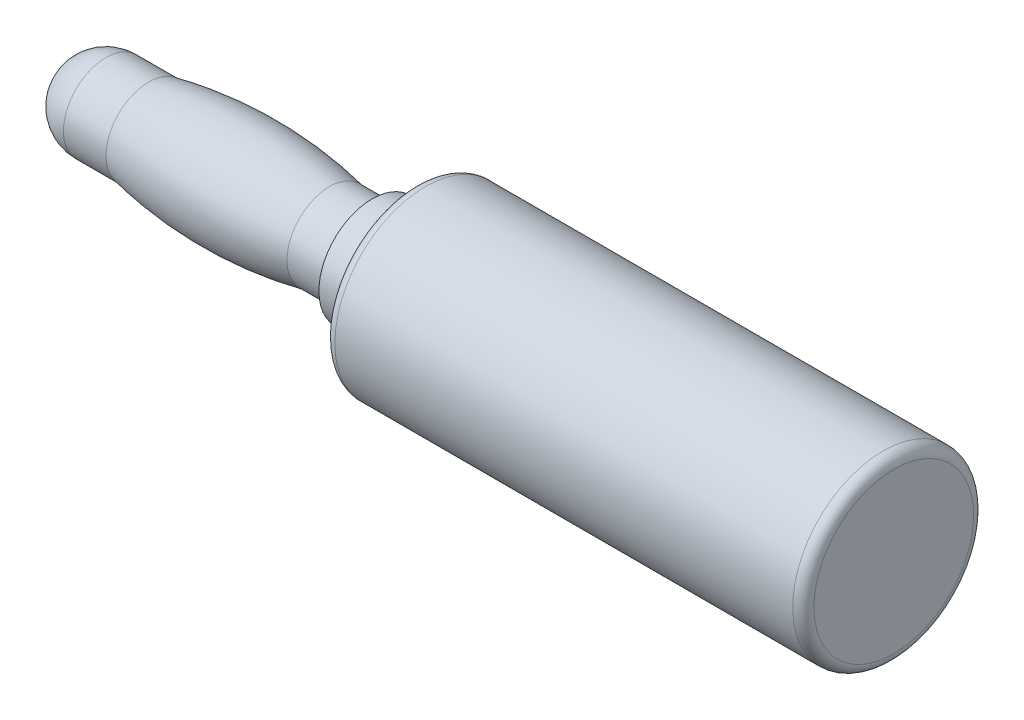
ISO-10303-21;
HEADER;
FILE_DESCRIPTION(('STEP AP214'),'2;1');
FILE_NAME('part.step','',(''),(''),'','','');
FILE_SCHEMA(('AUTOMOTIVE_DESIGN { 1 0 10303 214 1 1 1 1 }'));
ENDSEC;
DATA;
#1=APPLICATION_CONTEXT('core data for automotive mechanical design processes');
#2=APPLICATION_PROTOCOL_DEFINITION('international standard','automotive_design',2000,#1);
#3=PRODUCT_CONTEXT('',#1,'mechanical');
#4=PRODUCT('Part','Part','',(#3));
#5=PRODUCT_RELATED_PRODUCT_CATEGORY('part','',(#4));
#6=PRODUCT_DEFINITION_FORMATION('','',#4);
#7=PRODUCT_DEFINITION_CONTEXT('part definition',#1,'design');
#8=PRODUCT_DEFINITION('design','',#6,#7);
#9=PRODUCT_DEFINITION_SHAPE('','',#8);
#10=(LENGTH_UNIT() NAMED_UNIT(*) SI_UNIT(.MILLI.,.METRE.));
#11=(NAMED_UNIT(*) PLANE_ANGLE_UNIT() SI_UNIT($,.RADIAN.));
#12=(NAMED_UNIT(*) SI_UNIT($,.STERADIAN.) SOLID_ANGLE_UNIT());
#13=UNCERTAINTY_MEASURE_WITH_UNIT(LENGTH_MEASURE(1.E-05),#10,'distance_accuracy_value','');
#14=(GEOMETRIC_REPRESENTATION_CONTEXT(3) GLOBAL_UNCERTAINTY_ASSIGNED_CONTEXT((#13)) GLOBAL_UNIT_ASSIGNED_CONTEXT((#10,
#11,#12)) REPRESENTATION_CONTEXT('',''));
#15=CARTESIAN_POINT('',(0.,0.,0.));
#16=DIRECTION('',(0.,0.,1.));
#17=DIRECTION('',(1.,0.,0.));
#18=AXIS2_PLACEMENT_3D('',#15,#16,#17);
#19=CARTESIAN_POINT('',(0.,0.,0.));
#20=DIRECTION('',(1.,0.,0.));
#21=DIRECTION('',(0.,1.,0.));
#22=AXIS2_PLACEMENT_3D('',#19,#20,#21);
#23=PLANE('',#22);
#24=CARTESIAN_POINT('',(0.,0.,0.));
#25=DIRECTION('',(1.,0.,0.));
#26=DIRECTION('',(0.,1.,0.));
#27=AXIS2_PLACEMENT_3D('',#24,#25,#26);
#28=CIRCLE('',#27,3.74999999999996);
#29=CARTESIAN_POINT('',(0.,3.75000000000002,0.));
#30=VERTEX_POINT('',#29);
#31=EDGE_CURVE('E122',#30,#30,#28,.T.);
#32=ORIENTED_EDGE('',*,*,#31,.T.);
#33=EDGE_LOOP('',(#32));
#34=FACE_BOUND('',#33,.T.);
#35=ADVANCED_FACE('F45',(#34),#23,.T.);
#36=CARTESIAN_POINT('',(-37.,0.,0.));
#37=DIRECTION('',(1.,0.,0.));
#38=DIRECTION('',(0.,1.,0.));
#39=AXIS2_PLACEMENT_3D('',#36,#37,#38);
#40=SPHERICAL_SURFACE('',#39,2.);
#41=CARTESIAN_POINT('',(-37.,0.,0.));
#42=DIRECTION('',(1.,0.,0.));
#43=DIRECTION('',(0.,1.,0.));
#44=AXIS2_PLACEMENT_3D('',#41,#42,#43);
#45=CIRCLE('',#44,1.99999999999999);
#46=CARTESIAN_POINT('',(-37.,1.99999999999999,0.));
#47=VERTEX_POINT('',#46);
#48=EDGE_CURVE('E132',#47,#47,#45,.T.);
#49=ORIENTED_EDGE('',*,*,#48,.F.);
#50=EDGE_LOOP('',(#49));
#51=FACE_BOUND('',#50,.T.);
#52=ADVANCED_FACE('F94',(#51),#40,.T.);
#53=CARTESIAN_POINT('',(-39.,0.,0.));
#54=DIRECTION('',(1.,0.,0.));
#55=DIRECTION('',(0.,1.,0.));
#56=AXIS2_PLACEMENT_3D('',#53,#54,#55);
#57=CYLINDRICAL_SURFACE('',#56,1.99999999999999);
#58=ORIENTED_EDGE('',*,*,#48,.T.);
#59=EDGE_LOOP('',(#58));
#60=FACE_BOUND('',#59,.T.);
#61=CARTESIAN_POINT('',(-35.,0.,0.));
#62=DIRECTION('',(1.,0.,0.));
#63=DIRECTION('',(0.,1.,0.));
#64=AXIS2_PLACEMENT_3D('',#61,#62,#63);
#65=CIRCLE('',#64,1.99999999999999);
#66=CARTESIAN_POINT('',(-35.,2.,0.));
#67=VERTEX_POINT('',#66);
#68=EDGE_CURVE('E135',#67,#67,#65,.T.);
#69=ORIENTED_EDGE('',*,*,#68,.F.);
#70=EDGE_LOOP('',(#69));
#71=FACE_BOUND('',#70,.T.);
#72=ADVANCED_FACE('F100',(#60,#71),#57,.T.);
#73=CARTESIAN_POINT('',(-30.75,0.,0.));
#74=DIRECTION('',(1.,0.,0.));
#75=DIRECTION('',(0.,1.,0.));
#76=AXIS2_PLACEMENT_3D('',#73,#74,#75);
#77=DEGENERATE_TOROIDAL_SURFACE('',#76,18.6577238009088,21.0903782003698,.F.);
#78=ORIENTED_EDGE('',*,*,#68,.T.);
#79=EDGE_LOOP('',(#78));
#80=FACE_BOUND('',#79,.T.);
#81=CARTESIAN_POINT('',(-26.5,0.,0.));
#82=DIRECTION('',(1.,0.,0.));
#83=DIRECTION('',(0.,1.,0.));
#84=AXIS2_PLACEMENT_3D('',#81,#82,#83);
#85=CIRCLE('',#84,1.99999999999998);
#86=CARTESIAN_POINT('',(-26.5,2.,0.));
#87=VERTEX_POINT('',#86);
#88=EDGE_CURVE('E138',#87,#87,#85,.T.);
#89=ORIENTED_EDGE('',*,*,#88,.F.);
#90=EDGE_LOOP('',(#89));
#91=FACE_BOUND('',#90,.T.);
#92=ADVANCED_FACE('F234',(#80,#91),#77,.F.);
#93=CARTESIAN_POINT('',(-39.,0.,0.));
#94=DIRECTION('',(1.,0.,0.));
#95=DIRECTION('',(0.,1.,0.));
#96=AXIS2_PLACEMENT_3D('',#93,#94,#95);
#97=CYLINDRICAL_SURFACE('',#96,1.99999999999998);
#98=ORIENTED_EDGE('',*,*,#88,.T.);
#99=EDGE_LOOP('',(#98));
#100=FACE_BOUND('',#99,.T.);
#101=CARTESIAN_POINT('',(-24.5,0.,0.));
#102=DIRECTION('',(1.,0.,0.));
#103=DIRECTION('',(0.,1.,0.));
#104=AXIS2_PLACEMENT_3D('',#101,#102,#103);
#105=CIRCLE('',#104,1.99999999999997);
#106=CARTESIAN_POINT('',(-24.5,2.,0.));
#107=VERTEX_POINT('',#106);
#108=EDGE_CURVE('E141',#107,#107,#105,.T.);
#109=ORIENTED_EDGE('',*,*,#108,.F.);
#110=EDGE_LOOP('',(#109));
#111=FACE_BOUND('',#110,.T.);
#112=ADVANCED_FACE('F224',(#100,#111),#97,.T.);
#113=CARTESIAN_POINT('',(-24.5,2.5,0.));
#114=DIRECTION('',(-1.,0.,0.));
#115=DIRECTION('',(0.,-1.,0.));
#116=AXIS2_PLACEMENT_3D('',#113,#114,#115);
#117=PLANE('',#116);
#118=ORIENTED_EDGE('',*,*,#108,.T.);
#119=EDGE_LOOP('',(#118));
#120=FACE_BOUND('',#119,.T.);
#121=CARTESIAN_POINT('',(-24.5,0.,0.));
#122=DIRECTION('',(1.,0.,0.));
#123=DIRECTION('',(0.,1.,0.));
#124=AXIS2_PLACEMENT_3D('',#121,#122,#123);
#125=CIRCLE('',#124,2.49999999999997);
#126=CARTESIAN_POINT('',(-24.5,2.5,0.));
#127=VERTEX_POINT('',#126);
#128=EDGE_CURVE('E144',#127,#127,#125,.T.);
#129=ORIENTED_EDGE('',*,*,#128,.F.);
#130=EDGE_LOOP('',(#129));
#131=FACE_BOUND('',#130,.T.);
#132=ADVANCED_FACE('F214',(#120,#131),#117,.T.);
#133=CARTESIAN_POINT('',(-39.,0.,0.));
#134=DIRECTION('',(1.,0.,0.));
#135=DIRECTION('',(0.,1.,0.));
#136=AXIS2_PLACEMENT_3D('',#133,#134,#135);
#137=CYLINDRICAL_SURFACE('',#136,2.49999999999997);
#138=CARTESIAN_POINT('',(-23.,0.,0.));
#139=DIRECTION('',(-1.,0.,0.));
#140=DIRECTION('',(0.,-1.,0.));
#141=AXIS2_PLACEMENT_3D('',#138,#139,#140);
#142=CIRCLE('',#141,2.49999999999997);
#143=CARTESIAN_POINT('',(-23.,-2.49999999999995,0.));
#144=VERTEX_POINT('',#143);
#145=EDGE_CURVE('E123',#144,#144,#142,.T.);
#146=ORIENTED_EDGE('',*,*,#145,.T.);
#147=EDGE_LOOP('',(#146));
#148=FACE_BOUND('',#147,.T.);
#149=ORIENTED_EDGE('',*,*,#128,.T.);
#150=EDGE_LOOP('',(#149));
#151=FACE_BOUND('',#150,.T.);
#152=ADVANCED_FACE('F207',(#148,#151),#137,.T.);
#153=CARTESIAN_POINT('',(-22.5,4.25,0.));
#154=DIRECTION('',(-1.,0.,0.));
#155=DIRECTION('',(0.,-1.,0.));
#156=AXIS2_PLACEMENT_3D('',#153,#154,#155);
#157=PLANE('',#156);
#158=CARTESIAN_POINT('',(-22.5,0.,0.));
#159=DIRECTION('',(-1.,0.,0.));
#160=DIRECTION('',(0.,-1.,0.));
#161=AXIS2_PLACEMENT_3D('',#158,#159,#160);
#162=CIRCLE('',#161,3.74999999999996);
#163=CARTESIAN_POINT('',(-22.5,-3.74999999999993,0.));
#164=VERTEX_POINT('',#163);
#165=EDGE_CURVE('E10',#164,#164,#162,.T.);
#166=ORIENTED_EDGE('',*,*,#165,.T.);
#167=EDGE_LOOP('',(#166));
#168=FACE_BOUND('',#167,.T.);
#169=CARTESIAN_POINT('',(-22.5,0.,0.));
#170=DIRECTION('',(-1.,0.,0.));
#171=DIRECTION('',(0.,-1.,0.));
#172=AXIS2_PLACEMENT_3D('',#169,#170,#171);
#173=CIRCLE('',#172,2.99999999999999);
#174=CARTESIAN_POINT('',(-22.5,-2.99999999999997,0.));
#175=VERTEX_POINT('',#174);
#176=EDGE_CURVE('E127',#175,#175,#173,.F.);
#177=ORIENTED_EDGE('',*,*,#176,.T.);
#178=EDGE_LOOP('',(#177));
#179=FACE_BOUND('',#178,.T.);
#180=ADVANCED_FACE('F199',(#168,#179),#157,.T.);
#181=CARTESIAN_POINT('',(-39.,0.,0.));
#182=DIRECTION('',(1.,0.,0.));
#183=DIRECTION('',(0.,1.,0.));
#184=AXIS2_PLACEMENT_3D('',#181,#182,#183);
#185=CYLINDRICAL_SURFACE('',#184,4.24999999999996);
#186=CARTESIAN_POINT('',(-19.05,-3.74999999999992,2.00000000000001));
#187=CARTESIAN_POINT('',(-19.1551351063821,-3.75000826796803,1.99999278334831));
#188=CARTESIAN_POINT('',(-19.26042730687,-3.75448741611169,1.99165534548257));
#189=CARTESIAN_POINT('',(-19.4678515144892,-3.7717821759577,1.9586947567193));
#190=CARTESIAN_POINT('',(-19.569975535006,-3.78461730511005,1.93403347520457));
#191=CARTESIAN_POINT('',(-19.7676830955408,-3.81681669010783,1.86967542118156));
#192=CARTESIAN_POINT('',(-19.8632957176334,-3.83614926171444,1.830051499051));
#193=CARTESIAN_POINT('',(-20.0464930187898,-3.87911711724461,1.7371133035507));
#194=CARTESIAN_POINT('',(-20.1340780918536,-3.90275218982694,1.68379970257276));
#195=CARTESIAN_POINT('',(-20.3057761791103,-3.95376638499189,1.56044698465515));
#196=CARTESIAN_POINT('',(-20.38917516974,-3.981292756821,1.48947442523931));
#197=CARTESIAN_POINT('',(-20.5434317280766,-4.03579286280287,1.33476674141144));
#198=CARTESIAN_POINT('',(-20.6142836172328,-4.06276634186973,1.25102587007802));
#199=CARTESIAN_POINT('',(-20.7454454837746,-4.11499751826743,1.06720742669445));
#200=CARTESIAN_POINT('',(-20.8049048011291,-4.14006473333039,0.966463718686681));
#201=CARTESIAN_POINT('',(-20.9057108570117,-4.18378926835605,0.755005012555769));
#202=CARTESIAN_POINT('',(-20.947067751098,-4.20245018101856,0.644295647361232));
#203=CARTESIAN_POINT('',(-21.0077577751267,-4.23020518255971,0.423589142627611));
#204=CARTESIAN_POINT('',(-21.0283351919889,-4.23983689955257,0.314003244761928));
#205=CARTESIAN_POINT('',(-21.0509513380081,-4.25043525721599,0.0925416224293595));
#206=CARTESIAN_POINT('',(-21.052999850037,-4.2514064704465,-0.0193328624347068));
#207=CARTESIAN_POINT('',(-21.0390448864131,-4.24485266705171,-0.232957740722031));
#208=CARTESIAN_POINT('',(-21.024423648774,-4.23797816327227,-0.334822623791652));
#209=CARTESIAN_POINT('',(-20.9799788056287,-4.21745550548773,-0.534453784798));
#210=CARTESIAN_POINT('',(-20.9501540704467,-4.20380684814005,-0.63221975758631));
#211=CARTESIAN_POINT('',(-20.8758774709504,-4.17075647852699,-0.822665598035224));
#212=CARTESIAN_POINT('',(-20.8312153119756,-4.1512724760105,-0.915248575743634));
#213=CARTESIAN_POINT('',(-20.7287819878923,-4.10836318891228,-1.09184352283673));
#214=CARTESIAN_POINT('',(-20.67100601955,-4.08493646103166,-1.17585233535157));
#215=CARTESIAN_POINT('',(-20.5382386389836,-4.03401523997968,-1.34062814120459));
#216=CARTESIAN_POINT('',(-20.4621927117795,-4.006344176968,-1.42049184689529));
#217=CARTESIAN_POINT('',(-20.2979133656414,-3.95142965483077,-1.56678712698685));
#218=CARTESIAN_POINT('',(-20.2096724641763,-3.92418646975775,-1.6332103925353));
#219=CARTESIAN_POINT('',(-20.0179169246959,-3.87174945488614,-1.7540295774939));
#220=CARTESIAN_POINT('',(-19.9138513853599,-3.84673212699408,-1.80763495532405));
#221=CARTESIAN_POINT('',(-19.6967014855463,-3.80387372392291,-1.8961779554245));
#222=CARTESIAN_POINT('',(-19.5836256642997,-3.78602594870339,-1.93113301673437));
#223=CARTESIAN_POINT('',(-19.3606961373909,-3.76134460330738,-1.97875198730774));
#224=CARTESIAN_POINT('',(-19.2512421099273,-3.75378216701695,-1.99289764315747));
#225=CARTESIAN_POINT('',(-19.0312866509959,-3.74843861883772,-2.00293559518053));
#226=CARTESIAN_POINT('',(-18.9207858200787,-3.75065220179317,-1.99883779152855));
#227=CARTESIAN_POINT('',(-18.712590510147,-3.76384360402546,-1.97386396774598));
#228=CARTESIAN_POINT('',(-18.6146483912,-3.77400220115411,-1.95455509541394));
#229=CARTESIAN_POINT('',(-18.4235379607881,-3.80078810785445,-1.90193965757173));
#230=CARTESIAN_POINT('',(-18.3303710092433,-3.81741724871488,-1.86862912910832));
#231=CARTESIAN_POINT('',(-18.1466064421498,-3.85618583973208,-1.78730013829356));
#232=CARTESIAN_POINT('',(-18.0563254870845,-3.87854405125029,-1.7386742081627));
#233=CARTESIAN_POINT('',(-17.8847071803238,-3.92601486842514,-1.62864818014454));
#234=CARTESIAN_POINT('',(-17.8033743072674,-3.95112884093117,-1.56724172949261));
#235=CARTESIAN_POINT('',(-17.6427038072501,-4.00457596290915,-1.42555297710964));
#236=CARTESIAN_POINT('',(-17.5645493290614,-4.03296169775034,-1.343942958321));
#237=CARTESIAN_POINT('',(-17.4227314234118,-4.08732284866454,-1.16822321572152));
#238=CARTESIAN_POINT('',(-17.3590712321855,-4.11329772568413,-1.07411070781092));
#239=CARTESIAN_POINT('',(-17.2472972976474,-4.16048375973412,-0.873847730637521));
#240=CARTESIAN_POINT('',(-17.1994465769902,-4.18161268955565,-0.767529784141012));
#241=CARTESIAN_POINT('',(-17.1227492037265,-4.21611347538394,-0.547078644303476));
#242=CARTESIAN_POINT('',(-17.0938878063873,-4.22949134892526,-0.432951590741842));
#243=CARTESIAN_POINT('',(-17.0581987820791,-4.24612174611838,-0.210536703782477));
#244=CARTESIAN_POINT('',(-17.0497153202424,-4.25013436745775,-0.102570398118327));
#245=CARTESIAN_POINT('',(-17.0502990419966,-4.24985887396109,0.113289661299023));
#246=CARTESIAN_POINT('',(-17.0593614019901,-4.24557304048894,0.221183426837401));
#247=CARTESIAN_POINT('',(-17.0936256300385,-4.22962074592399,0.42775483968097));
#248=CARTESIAN_POINT('',(-17.1179315447508,-4.21836441710525,0.526615823187464));
#249=CARTESIAN_POINT('',(-17.1808735253732,-4.18991025109661,0.71874240116149));
#250=CARTESIAN_POINT('',(-17.2195118875086,-4.17271146188544,0.812007096255168));
#251=CARTESIAN_POINT('',(-17.311903449813,-4.13299701390712,0.994986067640839));
#252=CARTESIAN_POINT('',(-17.366260562096,-4.11027628014103,1.08434967071781));
#253=CARTESIAN_POINT('',(-17.4877516115414,-4.0620206412084,1.25307691467297));
#254=CARTESIAN_POINT('',(-17.5548913339601,-4.03648446401703,1.33243600049027));
#255=CARTESIAN_POINT('',(-17.7070062617157,-3.98254227734086,1.48629743882136));
#256=CARTESIAN_POINT('',(-17.7930358134209,-3.95408278559701,1.5597427906502));
#257=CARTESIAN_POINT('',(-17.9767920284928,-3.8995598263201,1.69145664018933));
#258=CARTESIAN_POINT('',(-18.0745271101748,-3.87349810731035,1.74971411835707));
#259=CARTESIAN_POINT('',(-18.2812910143234,-3.82664282343468,1.84998465272072));
#260=CARTESIAN_POINT('',(-18.3904701249221,-3.80593623458327,1.89173472202985));
#261=CARTESIAN_POINT('',(-18.5590734925624,-3.78158635213784,1.93969419917216));
#262=CARTESIAN_POINT('',(-18.6160256253766,-3.7745914281405,1.95323067130279));
#263=CARTESIAN_POINT('',(-18.731127869375,-3.76309905665179,1.97528331651136));
#264=CARTESIAN_POINT('',(-18.7892770774398,-3.75859979313669,1.98380314034535));
#265=CARTESIAN_POINT('',(-18.8813096281406,-3.75364230035754,1.99315910354233));
#266=CARTESIAN_POINT('',(-18.9149799404498,-3.75227911858258,1.99572230857722));
#267=CARTESIAN_POINT('',(-18.982428088024,-3.75045661730985,1.9991439586842));
#268=CARTESIAN_POINT('',(-19.0162059285095,-3.74999734238806,2.00000231968228));
#269=CARTESIAN_POINT('',(-19.05,-3.74999999999992,2.00000000000001));
#270=B_SPLINE_CURVE_WITH_KNOTS('',3,(#186,#187,#188,#189,#190,#191,#192,#193,#194,#195,#196,
#197,#198,#199,#200,#201,#202,#203,#204,#205,#206,#207,#208,#209,#210,#211,#212,#213,#214,#215,
#216,#217,#218,#219,#220,#221,#222,#223,#224,#225,#226,#227,#228,#229,#230,#231,#232,#233,#234,
#235,#236,#237,#238,#239,#240,#241,#242,#243,#244,#245,#246,#247,#248,#249,#250,#251,#252,#253,
#254,#255,#256,#257,#258,#259,#260,#261,#262,#263,#264,#265,#266,#267,#268,#269),.UNSPECIFIED.,
.T.,.F.,(4,2,2,2,2,2,2,2,2,2,2,2,2,2,2,2,2,2,2,2,2,2,2,2,2,2,2,2,2,2,2,2,2,2,2,2,2,2,2,2,2,4),
(0.,0.315269532227727,0.631278108915348,0.945767530612494,1.26024150858191,1.59755236089319,
1.93501548491414,2.29206735755066,2.64891866460437,2.98284261865034,3.31659025757552,
3.62455689648693,3.93254642178981,4.24510194492123,4.55777213395659,4.89738779630132,
5.23721277119903,5.59444791639953,5.95134843969611,6.28134455917522,6.61116162155772,
6.91084495979816,7.21061317596954,7.52420647490137,7.83795602433331,8.18589395188133,
8.53390948979741,8.88745332877818,9.24072232485335,9.56413887866949,9.8874665332751,
10.1933723847736,10.4993272671441,10.8191023907284,11.1390225862344,11.4873507068093,
11.835930857445,12.1898599395636,12.3664988027649,12.5430089615176,12.6443425322434,
12.7456811000871),.UNSPECIFIED.);
#271=CARTESIAN_POINT('',(-19.05,-3.74999999999992,2.00000000000001));
#272=VERTEX_POINT('',#271);
#273=EDGE_CURVE('E49',#272,#272,#270,.T.);
#274=ORIENTED_EDGE('',*,*,#273,.F.);
#275=EDGE_LOOP('',(#274));
#276=FACE_BOUND('',#275,.T.);
#277=CARTESIAN_POINT('',(-12.7,-3.74999999999991,2.));
#278=CARTESIAN_POINT('',(-12.8051351063821,-3.75000826796802,1.99999278334831));
#279=CARTESIAN_POINT('',(-12.91042730687,-3.75448741611169,1.99165534548257));
#280=CARTESIAN_POINT('',(-13.1178515144891,-3.77178217595769,1.9586947567193));
#281=CARTESIAN_POINT('',(-13.2199755350059,-3.78461730511004,1.93403347520457));
#282=CARTESIAN_POINT('',(-13.4176830955408,-3.81681669010782,1.86967542118155));
#283=CARTESIAN_POINT('',(-13.5132957176334,-3.83614926171444,1.830051499051));
#284=CARTESIAN_POINT('',(-13.6964930187898,-3.87911711724461,1.7371133035507));
#285=CARTESIAN_POINT('',(-13.7840780918536,-3.90275218982694,1.68379970257276));
#286=CARTESIAN_POINT('',(-13.9557761791103,-3.95376638499188,1.56044698465515));
#287=CARTESIAN_POINT('',(-14.03917516974,-3.98129275682099,1.48947442523931));
#288=CARTESIAN_POINT('',(-14.1934317280766,-4.03579286280286,1.33476674141144));
#289=CARTESIAN_POINT('',(-14.2642836172328,-4.06276634186972,1.25102587007802));
#290=CARTESIAN_POINT('',(-14.3954454837746,-4.11499751826742,1.06720742669445));
#291=CARTESIAN_POINT('',(-14.4549048011291,-4.14006473333038,0.966463718686681));
#292=CARTESIAN_POINT('',(-14.5557108570117,-4.18378926835604,0.755005012555768));
#293=CARTESIAN_POINT('',(-14.597067751098,-4.20245018101855,0.64429564736123));
#294=CARTESIAN_POINT('',(-14.6577577751267,-4.2302051825597,0.423589142627608));
#295=CARTESIAN_POINT('',(-14.6783351919889,-4.23983689955256,0.314003244761926));
#296=CARTESIAN_POINT('',(-14.7009513380081,-4.25043525721598,0.0925416224293584));
#297=CARTESIAN_POINT('',(-14.702999850037,-4.25140647044649,-0.0193328624347077));
#298=CARTESIAN_POINT('',(-14.6890448864131,-4.2448526670517,-0.232957740722031));
#299=CARTESIAN_POINT('',(-14.674423648774,-4.23797816327226,-0.334822623791652));
#300=CARTESIAN_POINT('',(-14.6299788056287,-4.21745550548772,-0.534453784797999));
#301=CARTESIAN_POINT('',(-14.6001540704467,-4.20380684814004,-0.63221975758631));
#302=CARTESIAN_POINT('',(-14.5258774709504,-4.17075647852698,-0.822665598035224));
#303=CARTESIAN_POINT('',(-14.4812153119756,-4.15127247601049,-0.915248575743632));
#304=CARTESIAN_POINT('',(-14.3787819878923,-4.10836318891227,-1.09184352283672));
#305=CARTESIAN_POINT('',(-14.32100601955,-4.08493646103165,-1.17585233535157));
#306=CARTESIAN_POINT('',(-14.1882386389836,-4.03401523997967,-1.34062814120459));
#307=CARTESIAN_POINT('',(-14.1121927117795,-4.00634417696799,-1.42049184689528));
#308=CARTESIAN_POINT('',(-13.9479133656414,-3.95142965483076,-1.56678712698685));
#309=CARTESIAN_POINT('',(-13.8596724641763,-3.92418646975775,-1.6332103925353));
#310=CARTESIAN_POINT('',(-13.6679169246959,-3.87174945488614,-1.7540295774939));
#311=CARTESIAN_POINT('',(-13.5638513853599,-3.84673212699407,-1.80763495532405));
#312=CARTESIAN_POINT('',(-13.3467014855463,-3.8038737239229,-1.8961779554245));
#313=CARTESIAN_POINT('',(-13.2336256642997,-3.78602594870338,-1.93113301673436));
#314=CARTESIAN_POINT('',(-13.0106961373909,-3.76134460330737,-1.97875198730773));
#315=CARTESIAN_POINT('',(-12.9012421099273,-3.75378216701695,-1.99289764315747));
#316=CARTESIAN_POINT('',(-12.6812866509959,-3.74843861883771,-2.00293559518052));
#317=CARTESIAN_POINT('',(-12.5707858200787,-3.75065220179317,-1.99883779152855));
#318=CARTESIAN_POINT('',(-12.362590510147,-3.76384360402545,-1.97386396774598));
#319=CARTESIAN_POINT('',(-12.2646483912,-3.7740022011541,-1.95455509541393));
#320=CARTESIAN_POINT('',(-12.0735379607881,-3.80078810785444,-1.90193965757173));
#321=CARTESIAN_POINT('',(-11.9803710092433,-3.81741724871487,-1.86862912910832));
#322=CARTESIAN_POINT('',(-11.7966064421498,-3.85618583973207,-1.78730013829356));
#323=CARTESIAN_POINT('',(-11.7063254870845,-3.87854405125028,-1.7386742081627));
#324=CARTESIAN_POINT('',(-11.5347071803238,-3.92601486842513,-1.62864818014454));
#325=CARTESIAN_POINT('',(-11.4533743072674,-3.95112884093116,-1.56724172949261));
#326=CARTESIAN_POINT('',(-11.2927038072501,-4.00457596290914,-1.42555297710963));
#327=CARTESIAN_POINT('',(-11.2145493290614,-4.03296169775033,-1.34394295832099));
#328=CARTESIAN_POINT('',(-11.0727314234118,-4.08732284866453,-1.16822321572152));
#329=CARTESIAN_POINT('',(-11.0090712321855,-4.11329772568412,-1.07411070781091));
#330=CARTESIAN_POINT('',(-10.8972972976474,-4.16048375973411,-0.87384773063752));
#331=CARTESIAN_POINT('',(-10.8494465769902,-4.18161268955564,-0.76752978414101));
#332=CARTESIAN_POINT('',(-10.7727492037265,-4.21611347538393,-0.547078644303475));
#333=CARTESIAN_POINT('',(-10.7438878063873,-4.22949134892525,-0.432951590741842));
#334=CARTESIAN_POINT('',(-10.7081987820791,-4.24612174611837,-0.210536703782476));
#335=CARTESIAN_POINT('',(-10.6997153202424,-4.25013436745773,-0.102570398118326));
#336=CARTESIAN_POINT('',(-10.7002990419966,-4.24985887396108,0.113289661299024));
#337=CARTESIAN_POINT('',(-10.7093614019901,-4.24557304048893,0.221183426837401));
#338=CARTESIAN_POINT('',(-10.7436256300385,-4.22962074592398,0.42775483968097));
#339=CARTESIAN_POINT('',(-10.7679315447508,-4.21836441710524,0.526615823187464));
#340=CARTESIAN_POINT('',(-10.8308735253732,-4.1899102510966,0.71874240116149));
#341=CARTESIAN_POINT('',(-10.8695118875086,-4.17271146188543,0.812007096255168));
#342=CARTESIAN_POINT('',(-10.961903449813,-4.13299701390711,0.994986067640839));
#343=CARTESIAN_POINT('',(-11.016260562096,-4.11027628014102,1.08434967071781));
#344=CARTESIAN_POINT('',(-11.1377516115414,-4.0620206412084,1.25307691467297));
#345=CARTESIAN_POINT('',(-11.2048913339601,-4.03648446401702,1.33243600049026));
#346=CARTESIAN_POINT('',(-11.3570062617158,-3.98254227734085,1.48629743882136));
#347=CARTESIAN_POINT('',(-11.4430358134209,-3.954082785597,1.5597427906502));
#348=CARTESIAN_POINT('',(-11.6267920284928,-3.89955982632009,1.69145664018932));
#349=CARTESIAN_POINT('',(-11.7245271101748,-3.87349810731034,1.74971411835706));
#350=CARTESIAN_POINT('',(-11.9312910143234,-3.82664282343468,1.84998465272071));
#351=CARTESIAN_POINT('',(-12.0404701249221,-3.80593623458326,1.89173472202985));
#352=CARTESIAN_POINT('',(-12.2090734925624,-3.78158635213783,1.93969419917216));
#353=CARTESIAN_POINT('',(-12.2660256253766,-3.77459142814049,1.95323067130279));
#354=CARTESIAN_POINT('',(-12.381127869375,-3.76309905665178,1.97528331651135));
#355=CARTESIAN_POINT('',(-12.4392770774398,-3.75859979313668,1.98380314034534));
#356=CARTESIAN_POINT('',(-12.5313096281406,-3.75364230035753,1.99315910354233));
#357=CARTESIAN_POINT('',(-12.5649799404498,-3.75227911858257,1.99572230857722));
#358=CARTESIAN_POINT('',(-12.632428088024,-3.75045661730985,1.9991439586842));
#359=CARTESIAN_POINT('',(-12.6662059285095,-3.74999734238805,2.00000231968228));
#360=CARTESIAN_POINT('',(-12.7,-3.74999999999991,2.));
#361=B_SPLINE_CURVE_WITH_KNOTS('',3,(#277,#278,#279,#280,#281,#282,#283,#284,#285,#286,#287,
#288,#289,#290,#291,#292,#293,#294,#295,#296,#297,#298,#299,#300,#301,#302,#303,#304,#305,#306,
#307,#308,#309,#310,#311,#312,#313,#314,#315,#316,#317,#318,#319,#320,#321,#322,#323,#324,#325,
#326,#327,#328,#329,#330,#331,#332,#333,#334,#335,#336,#337,#338,#339,#340,#341,#342,#343,#344,
#345,#346,#347,#348,#349,#350,#351,#352,#353,#354,#355,#356,#357,#358,#359,#360),.UNSPECIFIED.,
.T.,.F.,(4,2,2,2,2,2,2,2,2,2,2,2,2,2,2,2,2,2,2,2,2,2,2,2,2,2,2,2,2,2,2,2,2,2,2,2,2,2,2,2,2,4),
(0.,0.315269532227726,0.631278108915347,0.945767530612491,1.26024150858191,1.59755236089319,
1.93501548491413,2.29206735755065,2.64891866460437,2.98284261865034,3.31659025757551,
3.62455689648693,3.93254642178981,4.24510194492122,4.55777213395658,4.89738779630131,
5.23721277119902,5.59444791639952,5.9513484396961,6.28134455917521,6.61116162155771,
6.91084495979815,7.21061317596952,7.52420647490136,7.8379560243333,8.18589395188132,
8.5339094897974,8.88745332877816,9.24072232485333,9.56413887866948,9.88746653327509,
10.1933723847735,10.4993272671441,10.8191023907284,11.1390225862344,11.4873507068093,
11.835930857445,12.1898599395636,12.3664988027649,12.5430089615176,12.6443425322433,
12.7456811000871),.UNSPECIFIED.);
#362=CARTESIAN_POINT('',(-12.7,-3.74999999999991,2.));
#363=VERTEX_POINT('',#362);
#364=EDGE_CURVE('E66',#363,#363,#361,.T.);
#365=ORIENTED_EDGE('',*,*,#364,.F.);
#366=EDGE_LOOP('',(#365));
#367=FACE_BOUND('',#366,.T.);
#368=CARTESIAN_POINT('',(-0.499999999999994,0.,0.));
#369=DIRECTION('',(1.,0.,0.));
#370=DIRECTION('',(0.,1.,0.));
#371=AXIS2_PLACEMENT_3D('',#368,#369,#370);
#372=CIRCLE('',#371,4.24999999999996);
#373=CARTESIAN_POINT('',(-0.5,4.25000000000002,0.));
#374=VERTEX_POINT('',#373);
#375=EDGE_CURVE('E58',#374,#374,#372,.F.);
#376=ORIENTED_EDGE('',*,*,#375,.T.);
#377=EDGE_LOOP('',(#376));
#378=FACE_BOUND('',#377,.T.);
#379=CARTESIAN_POINT('',(-22.,0.,0.));
#380=DIRECTION('',(-1.,0.,0.));
#381=DIRECTION('',(0.,-1.,0.));
#382=AXIS2_PLACEMENT_3D('',#379,#380,#381);
#383=CIRCLE('',#382,4.24999999999996);
#384=CARTESIAN_POINT('',(-22.,-4.24999999999993,0.));
#385=VERTEX_POINT('',#384);
#386=EDGE_CURVE('E63',#385,#385,#383,.F.);
#387=ORIENTED_EDGE('',*,*,#386,.T.);
#388=EDGE_LOOP('',(#387));
#389=FACE_BOUND('',#388,.T.);
#390=ADVANCED_FACE('F73',(#276,#367,#378,#389),#185,.T.);
#391=CARTESIAN_POINT('',(-22.5,0.,0.));
#392=DIRECTION('',(1.,0.,0.));
#393=DIRECTION('',(0.,1.,0.));
#394=AXIS2_PLACEMENT_3D('',#391,#392,#393);
#395=CONICAL_SURFACE('',#394,2.99999999999999,0.785398163397453);
#396=ORIENTED_EDGE('',*,*,#145,.F.);
#397=EDGE_LOOP('',(#396));
#398=FACE_BOUND('',#397,.T.);
#399=ORIENTED_EDGE('',*,*,#176,.F.);
#400=EDGE_LOOP('',(#399));
#401=FACE_BOUND('',#400,.T.);
#402=ADVANCED_FACE('F107',(#398,#401),#395,.T.);
#403=CARTESIAN_POINT('',(-0.499999999999994,0.,0.));
#404=DIRECTION('',(1.,0.,0.));
#405=DIRECTION('',(0.,1.,0.));
#406=AXIS2_PLACEMENT_3D('',#403,#404,#405);
#407=TOROIDAL_SURFACE('',#406,3.74999999999996,0.5);
#408=ORIENTED_EDGE('',*,*,#375,.F.);
#409=EDGE_LOOP('',(#408));
#410=FACE_BOUND('',#409,.T.);
#411=ORIENTED_EDGE('',*,*,#31,.F.);
#412=EDGE_LOOP('',(#411));
#413=FACE_BOUND('',#412,.T.);
#414=ADVANCED_FACE('F111',(#410,#413),#407,.T.);
#415=CARTESIAN_POINT('',(-22.,0.,0.));
#416=DIRECTION('',(-1.,0.,0.));
#417=DIRECTION('',(0.,-1.,0.));
#418=AXIS2_PLACEMENT_3D('',#415,#416,#417);
#419=TOROIDAL_SURFACE('',#418,3.74999999999996,0.5);
#420=ORIENTED_EDGE('',*,*,#165,.F.);
#421=EDGE_LOOP('',(#420));
#422=FACE_BOUND('',#421,.T.);
#423=ORIENTED_EDGE('',*,*,#386,.F.);
#424=EDGE_LOOP('',(#423));
#425=FACE_BOUND('',#424,.T.);
#426=ADVANCED_FACE('F47',(#422,#425),#419,.T.);
#427=CARTESIAN_POINT('',(-12.7,-25.4,0.));
#428=DIRECTION('',(0.,1.,0.));
#429=DIRECTION('',(0.,0.,1.));
#430=AXIS2_PLACEMENT_3D('',#427,#428,#429);
#431=CYLINDRICAL_SURFACE('',#430,2.);
#432=ORIENTED_EDGE('',*,*,#364,.T.);
#433=EDGE_LOOP('',(#432));
#434=FACE_BOUND('',#433,.T.);
#435=CARTESIAN_POINT('',(-12.7,0.,0.));
#436=DIRECTION('',(0.,1.,0.));
#437=DIRECTION('',(0.,0.,1.));
#438=AXIS2_PLACEMENT_3D('',#435,#436,#437);
#439=CIRCLE('',#438,2.);
#440=CARTESIAN_POINT('',(-12.7,0.,2.));
#441=VERTEX_POINT('',#440);
#442=EDGE_CURVE('E147',#441,#441,#439,.T.);
#443=ORIENTED_EDGE('',*,*,#442,.T.);
#444=EDGE_LOOP('',(#443));
#445=FACE_BOUND('',#444,.T.);
#446=ADVANCED_FACE('F77',(#434,#445),#431,.F.);
#447=CARTESIAN_POINT('',(-12.7,0.,0.));
#448=DIRECTION('',(0.,1.,0.));
#449=DIRECTION('',(0.,0.,1.));
#450=AXIS2_PLACEMENT_3D('',#447,#448,#449);
#451=PLANE('',#450);
#452=ORIENTED_EDGE('',*,*,#442,.F.);
#453=EDGE_LOOP('',(#452));
#454=FACE_BOUND('',#453,.T.);
#455=ADVANCED_FACE('F80',(#454),#451,.F.);
#456=CARTESIAN_POINT('',(-19.05,-25.4,0.));
#457=DIRECTION('',(0.,1.,0.));
#458=DIRECTION('',(0.,0.,1.));
#459=AXIS2_PLACEMENT_3D('',#456,#457,#458);
#460=CYLINDRICAL_SURFACE('',#459,2.);
#461=ORIENTED_EDGE('',*,*,#273,.T.);
#462=EDGE_LOOP('',(#461));
#463=FACE_BOUND('',#462,.T.);
#464=CARTESIAN_POINT('',(-19.05,0.,0.));
#465=DIRECTION('',(0.,1.,0.));
#466=DIRECTION('',(0.,0.,1.));
#467=AXIS2_PLACEMENT_3D('',#464,#465,#466);
#468=CIRCLE('',#467,2.);
#469=CARTESIAN_POINT('',(-19.05,0.,2.00000000000001));
#470=VERTEX_POINT('',#469);
#471=EDGE_CURVE('E72',#470,#470,#468,.T.);
#472=ORIENTED_EDGE('',*,*,#471,.T.);
#473=EDGE_LOOP('',(#472));
#474=FACE_BOUND('',#473,.T.);
#475=ADVANCED_FACE('F82',(#463,#474),#460,.F.);
#476=CARTESIAN_POINT('',(-19.05,0.,0.));
#477=DIRECTION('',(0.,1.,0.));
#478=DIRECTION('',(0.,0.,1.));
#479=AXIS2_PLACEMENT_3D('',#476,#477,#478);
#480=PLANE('',#479);
#481=ORIENTED_EDGE('',*,*,#471,.F.);
#482=EDGE_LOOP('',(#481));
#483=FACE_BOUND('',#482,.T.);
#484=ADVANCED_FACE('F90',(#483),#480,.F.);
#485=CLOSED_SHELL('',(#35,#52,#72,#92,#112,#132,#152,#180,#390,#402,#414,#426,#446,#455,#475,#484));
#486=MANIFOLD_SOLID_BREP('B2',#485);
#487=ADVANCED_BREP_SHAPE_REPRESENTATION('',(#18,#486),#14);
#488=SHAPE_DEFINITION_REPRESENTATION(#9,#487);
ENDSEC;
END-ISO-10303-21;
